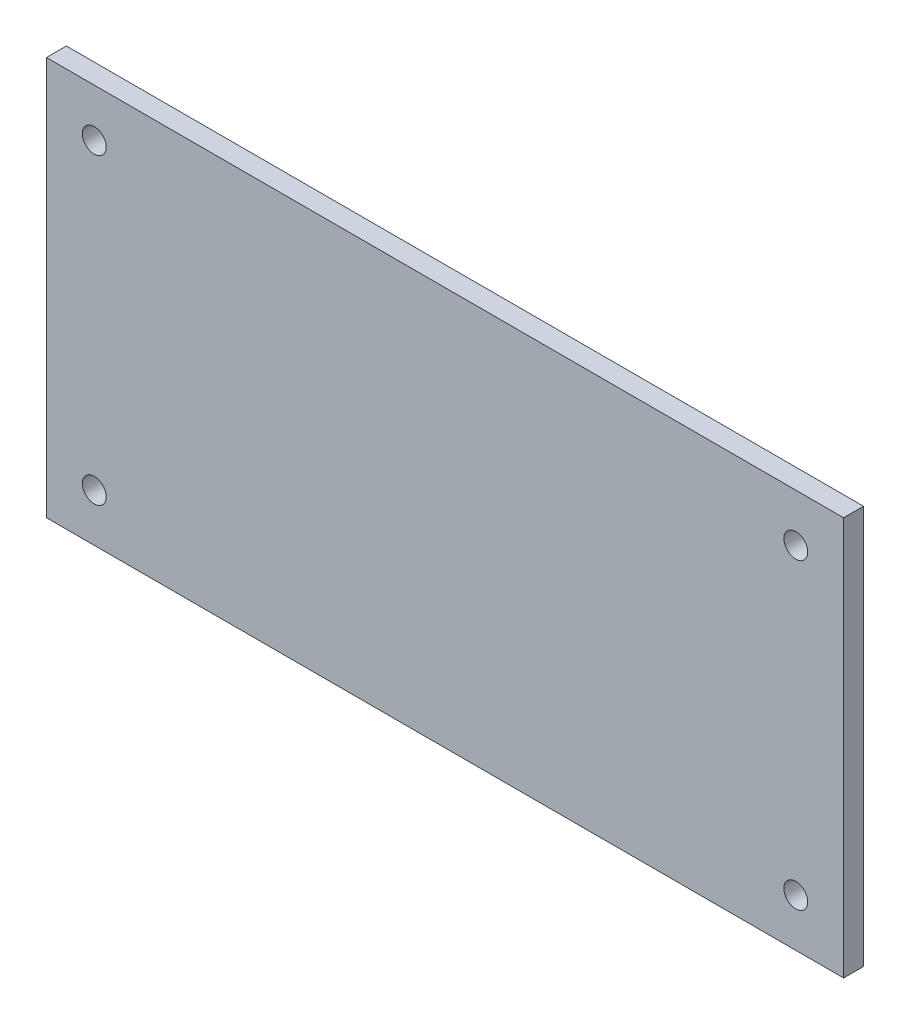
ISO-10303-21;
HEADER;
FILE_DESCRIPTION(('STEP AP214'),'2;1');
FILE_NAME('part.step','',(''),(''),'','','');
FILE_SCHEMA(('AUTOMOTIVE_DESIGN { 1 0 10303 214 1 1 1 1 }'));
ENDSEC;
DATA;
#1=APPLICATION_CONTEXT('core data for automotive mechanical design processes');
#2=APPLICATION_PROTOCOL_DEFINITION('international standard','automotive_design',2000,#1);
#3=PRODUCT_CONTEXT('',#1,'mechanical');
#4=PRODUCT('Part','Part','',(#3));
#5=PRODUCT_RELATED_PRODUCT_CATEGORY('part','',(#4));
#6=PRODUCT_DEFINITION_FORMATION('','',#4);
#7=PRODUCT_DEFINITION_CONTEXT('part definition',#1,'design');
#8=PRODUCT_DEFINITION('design','',#6,#7);
#9=PRODUCT_DEFINITION_SHAPE('','',#8);
#10=(LENGTH_UNIT() NAMED_UNIT(*) SI_UNIT(.MILLI.,.METRE.));
#11=(NAMED_UNIT(*) PLANE_ANGLE_UNIT() SI_UNIT($,.RADIAN.));
#12=(NAMED_UNIT(*) SI_UNIT($,.STERADIAN.) SOLID_ANGLE_UNIT());
#13=UNCERTAINTY_MEASURE_WITH_UNIT(LENGTH_MEASURE(1.E-05),#10,'distance_accuracy_value','');
#14=(GEOMETRIC_REPRESENTATION_CONTEXT(3) GLOBAL_UNCERTAINTY_ASSIGNED_CONTEXT((#13)) GLOBAL_UNIT_ASSIGNED_CONTEXT((#10,
#11,#12)) REPRESENTATION_CONTEXT('',''));
#15=CARTESIAN_POINT('',(0.,0.,0.));
#16=DIRECTION('',(0.,0.,1.));
#17=DIRECTION('',(1.,0.,0.));
#18=AXIS2_PLACEMENT_3D('',#15,#16,#17);
#19=CARTESIAN_POINT('',(1000.,-500.,50.));
#20=DIRECTION('',(-1.,0.,0.));
#21=DIRECTION('',(0.,0.,1.));
#22=AXIS2_PLACEMENT_3D('',#19,#20,#21);
#23=PLANE('',#22);
#24=DIRECTION('',(0.,1.,0.));
#25=VECTOR('',#24,1.);
#26=CARTESIAN_POINT('',(1000.,-500.,0.));
#27=LINE('',#26,#25);
#28=CARTESIAN_POINT('',(1000.,-500.,0.));
#29=VERTEX_POINT('',#28);
#30=CARTESIAN_POINT('',(1000.,500.,0.));
#31=VERTEX_POINT('',#30);
#32=EDGE_CURVE('E104',#29,#31,#27,.T.);
#33=ORIENTED_EDGE('',*,*,#32,.T.);
#34=DIRECTION('',(0.,0.,-1.));
#35=VECTOR('',#34,1.);
#36=CARTESIAN_POINT('',(1000.,500.,50.));
#37=LINE('',#36,#35);
#38=CARTESIAN_POINT('',(1000.,500.,50.));
#39=VERTEX_POINT('',#38);
#40=EDGE_CURVE('E11',#39,#31,#37,.T.);
#41=ORIENTED_EDGE('',*,*,#40,.F.);
#42=DIRECTION('',(0.,1.,0.));
#43=VECTOR('',#42,1.);
#44=CARTESIAN_POINT('',(1000.,-500.,50.));
#45=LINE('',#44,#43);
#46=CARTESIAN_POINT('',(1000.,-500.,50.));
#47=VERTEX_POINT('',#46);
#48=EDGE_CURVE('E92',#47,#39,#45,.T.);
#49=ORIENTED_EDGE('',*,*,#48,.F.);
#50=DIRECTION('',(0.,0.,-1.));
#51=VECTOR('',#50,1.);
#52=CARTESIAN_POINT('',(1000.,-500.,50.));
#53=LINE('',#52,#51);
#54=EDGE_CURVE('E100',#47,#29,#53,.T.);
#55=ORIENTED_EDGE('',*,*,#54,.T.);
#56=EDGE_LOOP('',(#33,#41,#49,#55));
#57=FACE_BOUND('',#56,.T.);
#58=ADVANCED_FACE('F41',(#57),#23,.F.);
#59=CARTESIAN_POINT('',(-1000.,500.,50.));
#60=DIRECTION('',(0.,-1.,0.));
#61=DIRECTION('',(0.,0.,-1.));
#62=AXIS2_PLACEMENT_3D('',#59,#60,#61);
#63=PLANE('',#62);
#64=DIRECTION('',(-1.,0.,0.));
#65=VECTOR('',#64,1.);
#66=CARTESIAN_POINT('',(-1000.,500.,0.));
#67=LINE('',#66,#65);
#68=CARTESIAN_POINT('',(-1000.,500.,0.));
#69=VERTEX_POINT('',#68);
#70=EDGE_CURVE('E96',#31,#69,#67,.T.);
#71=ORIENTED_EDGE('',*,*,#70,.T.);
#72=DIRECTION('',(0.,0.,-1.));
#73=VECTOR('',#72,1.);
#74=CARTESIAN_POINT('',(-1000.,500.,50.));
#75=LINE('',#74,#73);
#76=CARTESIAN_POINT('',(-1000.,500.,50.));
#77=VERTEX_POINT('',#76);
#78=EDGE_CURVE('E49',#77,#69,#75,.T.);
#79=ORIENTED_EDGE('',*,*,#78,.F.);
#80=DIRECTION('',(-1.,0.,0.));
#81=VECTOR('',#80,1.);
#82=CARTESIAN_POINT('',(-1000.,500.,50.));
#83=LINE('',#82,#81);
#84=EDGE_CURVE('E87',#39,#77,#83,.T.);
#85=ORIENTED_EDGE('',*,*,#84,.F.);
#86=ORIENTED_EDGE('',*,*,#40,.T.);
#87=EDGE_LOOP('',(#71,#79,#85,#86));
#88=FACE_BOUND('',#87,.T.);
#89=ADVANCED_FACE('F95',(#88),#63,.F.);
#90=CARTESIAN_POINT('',(-1000.,-500.,50.));
#91=DIRECTION('',(1.,0.,0.));
#92=DIRECTION('',(0.,0.,-1.));
#93=AXIS2_PLACEMENT_3D('',#90,#91,#92);
#94=PLANE('',#93);
#95=DIRECTION('',(0.,-1.,0.));
#96=VECTOR('',#95,1.);
#97=CARTESIAN_POINT('',(-1000.,-500.,0.));
#98=LINE('',#97,#96);
#99=CARTESIAN_POINT('',(-1000.,-500.,0.));
#100=VERTEX_POINT('',#99);
#101=EDGE_CURVE('E74',#69,#100,#98,.T.);
#102=ORIENTED_EDGE('',*,*,#101,.T.);
#103=DIRECTION('',(0.,0.,-1.));
#104=VECTOR('',#103,1.);
#105=CARTESIAN_POINT('',(-1000.,-500.,50.));
#106=LINE('',#105,#104);
#107=CARTESIAN_POINT('',(-1000.,-500.,50.));
#108=VERTEX_POINT('',#107);
#109=EDGE_CURVE('E97',#108,#100,#106,.T.);
#110=ORIENTED_EDGE('',*,*,#109,.F.);
#111=DIRECTION('',(0.,-1.,0.));
#112=VECTOR('',#111,1.);
#113=CARTESIAN_POINT('',(-1000.,-500.,50.));
#114=LINE('',#113,#112);
#115=EDGE_CURVE('E90',#77,#108,#114,.T.);
#116=ORIENTED_EDGE('',*,*,#115,.F.);
#117=ORIENTED_EDGE('',*,*,#78,.T.);
#118=EDGE_LOOP('',(#102,#110,#116,#117));
#119=FACE_BOUND('',#118,.T.);
#120=ADVANCED_FACE('F98',(#119),#94,.F.);
#121=CARTESIAN_POINT('',(-1000.,-500.,50.));
#122=DIRECTION('',(0.,1.,0.));
#123=DIRECTION('',(0.,0.,1.));
#124=AXIS2_PLACEMENT_3D('',#121,#122,#123);
#125=PLANE('',#124);
#126=DIRECTION('',(1.,0.,0.));
#127=VECTOR('',#126,1.);
#128=CARTESIAN_POINT('',(-1000.,-500.,0.));
#129=LINE('',#128,#127);
#130=EDGE_CURVE('E80',#100,#29,#129,.T.);
#131=ORIENTED_EDGE('',*,*,#130,.T.);
#132=ORIENTED_EDGE('',*,*,#54,.F.);
#133=DIRECTION('',(1.,0.,0.));
#134=VECTOR('',#133,1.);
#135=CARTESIAN_POINT('',(-1000.,-500.,50.));
#136=LINE('',#135,#134);
#137=EDGE_CURVE('E57',#108,#47,#136,.T.);
#138=ORIENTED_EDGE('',*,*,#137,.F.);
#139=ORIENTED_EDGE('',*,*,#109,.T.);
#140=EDGE_LOOP('',(#131,#132,#138,#139));
#141=FACE_BOUND('',#140,.T.);
#142=ADVANCED_FACE('F112',(#141),#125,.F.);
#143=CARTESIAN_POINT('',(0.,0.,50.));
#144=DIRECTION('',(0.,0.,-1.));
#145=DIRECTION('',(-1.,0.,0.));
#146=AXIS2_PLACEMENT_3D('',#143,#144,#145);
#147=PLANE('',#146);
#148=CARTESIAN_POINT('',(-880.,-380.,50.));
#149=DIRECTION('',(0.,0.,1.));
#150=DIRECTION('',(1.,0.,0.));
#151=AXIS2_PLACEMENT_3D('',#148,#149,#150);
#152=CIRCLE('',#151,30.0000000000001);
#153=CARTESIAN_POINT('',(-850.,-380.,50.));
#154=VERTEX_POINT('',#153);
#155=EDGE_CURVE('E133',#154,#154,#152,.T.);
#156=ORIENTED_EDGE('',*,*,#155,.F.);
#157=EDGE_LOOP('',(#156));
#158=FACE_BOUND('',#157,.T.);
#159=CARTESIAN_POINT('',(-880.,380.,50.));
#160=DIRECTION('',(0.,0.,1.));
#161=DIRECTION('',(1.,0.,0.));
#162=AXIS2_PLACEMENT_3D('',#159,#160,#161);
#163=CIRCLE('',#162,30.0000000000001);
#164=CARTESIAN_POINT('',(-850.,380.,50.));
#165=VERTEX_POINT('',#164);
#166=EDGE_CURVE('E127',#165,#165,#163,.T.);
#167=ORIENTED_EDGE('',*,*,#166,.F.);
#168=EDGE_LOOP('',(#167));
#169=FACE_BOUND('',#168,.T.);
#170=CARTESIAN_POINT('',(880.,-380.,50.));
#171=DIRECTION('',(0.,0.,1.));
#172=DIRECTION('',(1.,0.,0.));
#173=AXIS2_PLACEMENT_3D('',#170,#171,#172);
#174=CIRCLE('',#173,30.0000000000001);
#175=CARTESIAN_POINT('',(910.,-380.,50.));
#176=VERTEX_POINT('',#175);
#177=EDGE_CURVE('E121',#176,#176,#174,.T.);
#178=ORIENTED_EDGE('',*,*,#177,.F.);
#179=EDGE_LOOP('',(#178));
#180=FACE_BOUND('',#179,.T.);
#181=CARTESIAN_POINT('',(880.,380.,50.));
#182=DIRECTION('',(0.,0.,1.));
#183=DIRECTION('',(1.,0.,0.));
#184=AXIS2_PLACEMENT_3D('',#181,#182,#183);
#185=CIRCLE('',#184,30.0000000000001);
#186=CARTESIAN_POINT('',(910.,380.,50.));
#187=VERTEX_POINT('',#186);
#188=EDGE_CURVE('E107',#187,#187,#185,.T.);
#189=ORIENTED_EDGE('',*,*,#188,.F.);
#190=EDGE_LOOP('',(#189));
#191=FACE_BOUND('',#190,.T.);
#192=ORIENTED_EDGE('',*,*,#48,.T.);
#193=ORIENTED_EDGE('',*,*,#84,.T.);
#194=ORIENTED_EDGE('',*,*,#115,.T.);
#195=ORIENTED_EDGE('',*,*,#137,.T.);
#196=EDGE_LOOP('',(#192,#193,#194,#195));
#197=FACE_BOUND('',#196,.T.);
#198=ADVANCED_FACE('F88',(#158,#169,#180,#191,#197),#147,.F.);
#199=CARTESIAN_POINT('',(0.,0.,0.));
#200=DIRECTION('',(0.,0.,-1.));
#201=DIRECTION('',(-1.,0.,0.));
#202=AXIS2_PLACEMENT_3D('',#199,#200,#201);
#203=PLANE('',#202);
#204=CARTESIAN_POINT('',(-880.,-380.,0.));
#205=DIRECTION('',(0.,0.,1.));
#206=DIRECTION('',(1.,0.,0.));
#207=AXIS2_PLACEMENT_3D('',#204,#205,#206);
#208=CIRCLE('',#207,30.0000000000001);
#209=CARTESIAN_POINT('',(-850.,-380.,0.));
#210=VERTEX_POINT('',#209);
#211=EDGE_CURVE('E136',#210,#210,#208,.T.);
#212=ORIENTED_EDGE('',*,*,#211,.T.);
#213=EDGE_LOOP('',(#212));
#214=FACE_BOUND('',#213,.T.);
#215=CARTESIAN_POINT('',(-880.,380.,0.));
#216=DIRECTION('',(0.,0.,1.));
#217=DIRECTION('',(1.,0.,0.));
#218=AXIS2_PLACEMENT_3D('',#215,#216,#217);
#219=CIRCLE('',#218,30.0000000000001);
#220=CARTESIAN_POINT('',(-850.,380.,0.));
#221=VERTEX_POINT('',#220);
#222=EDGE_CURVE('E130',#221,#221,#219,.T.);
#223=ORIENTED_EDGE('',*,*,#222,.T.);
#224=EDGE_LOOP('',(#223));
#225=FACE_BOUND('',#224,.T.);
#226=CARTESIAN_POINT('',(880.,-380.,0.));
#227=DIRECTION('',(0.,0.,1.));
#228=DIRECTION('',(1.,0.,0.));
#229=AXIS2_PLACEMENT_3D('',#226,#227,#228);
#230=CIRCLE('',#229,30.0000000000001);
#231=CARTESIAN_POINT('',(910.,-380.,0.));
#232=VERTEX_POINT('',#231);
#233=EDGE_CURVE('E124',#232,#232,#230,.T.);
#234=ORIENTED_EDGE('',*,*,#233,.T.);
#235=EDGE_LOOP('',(#234));
#236=FACE_BOUND('',#235,.T.);
#237=CARTESIAN_POINT('',(880.,380.,0.));
#238=DIRECTION('',(0.,0.,1.));
#239=DIRECTION('',(1.,0.,0.));
#240=AXIS2_PLACEMENT_3D('',#237,#238,#239);
#241=CIRCLE('',#240,30.0000000000001);
#242=CARTESIAN_POINT('',(910.,380.,0.));
#243=VERTEX_POINT('',#242);
#244=EDGE_CURVE('E118',#243,#243,#241,.T.);
#245=ORIENTED_EDGE('',*,*,#244,.T.);
#246=EDGE_LOOP('',(#245));
#247=FACE_BOUND('',#246,.T.);
#248=ORIENTED_EDGE('',*,*,#32,.F.);
#249=ORIENTED_EDGE('',*,*,#130,.F.);
#250=ORIENTED_EDGE('',*,*,#101,.F.);
#251=ORIENTED_EDGE('',*,*,#70,.F.);
#252=EDGE_LOOP('',(#248,#249,#250,#251));
#253=FACE_BOUND('',#252,.T.);
#254=ADVANCED_FACE('F115',(#214,#225,#236,#247,#253),#203,.T.);
#255=CARTESIAN_POINT('',(880.,380.,50.));
#256=DIRECTION('',(0.,0.,-1.));
#257=DIRECTION('',(-1.,0.,0.));
#258=AXIS2_PLACEMENT_3D('',#255,#256,#257);
#259=CYLINDRICAL_SURFACE('',#258,30.0000000000001);
#260=ORIENTED_EDGE('',*,*,#188,.T.);
#261=EDGE_LOOP('',(#260));
#262=FACE_BOUND('',#261,.T.);
#263=ORIENTED_EDGE('',*,*,#244,.F.);
#264=EDGE_LOOP('',(#263));
#265=FACE_BOUND('',#264,.T.);
#266=ADVANCED_FACE('F154',(#262,#265),#259,.F.);
#267=CARTESIAN_POINT('',(880.,-380.,50.));
#268=DIRECTION('',(0.,0.,-1.));
#269=DIRECTION('',(-1.,0.,0.));
#270=AXIS2_PLACEMENT_3D('',#267,#268,#269);
#271=CYLINDRICAL_SURFACE('',#270,30.0000000000001);
#272=ORIENTED_EDGE('',*,*,#177,.T.);
#273=EDGE_LOOP('',(#272));
#274=FACE_BOUND('',#273,.T.);
#275=ORIENTED_EDGE('',*,*,#233,.F.);
#276=EDGE_LOOP('',(#275));
#277=FACE_BOUND('',#276,.T.);
#278=ADVANCED_FACE('F157',(#274,#277),#271,.F.);
#279=CARTESIAN_POINT('',(-880.,380.,50.));
#280=DIRECTION('',(0.,0.,-1.));
#281=DIRECTION('',(-1.,0.,0.));
#282=AXIS2_PLACEMENT_3D('',#279,#280,#281);
#283=CYLINDRICAL_SURFACE('',#282,30.0000000000001);
#284=ORIENTED_EDGE('',*,*,#166,.T.);
#285=EDGE_LOOP('',(#284));
#286=FACE_BOUND('',#285,.T.);
#287=ORIENTED_EDGE('',*,*,#222,.F.);
#288=EDGE_LOOP('',(#287));
#289=FACE_BOUND('',#288,.T.);
#290=ADVANCED_FACE('F195',(#286,#289),#283,.F.);
#291=CARTESIAN_POINT('',(-880.,-380.,50.));
#292=DIRECTION('',(0.,0.,-1.));
#293=DIRECTION('',(-1.,0.,0.));
#294=AXIS2_PLACEMENT_3D('',#291,#292,#293);
#295=CYLINDRICAL_SURFACE('',#294,30.0000000000001);
#296=ORIENTED_EDGE('',*,*,#155,.T.);
#297=EDGE_LOOP('',(#296));
#298=FACE_BOUND('',#297,.T.);
#299=ORIENTED_EDGE('',*,*,#211,.F.);
#300=EDGE_LOOP('',(#299));
#301=FACE_BOUND('',#300,.T.);
#302=ADVANCED_FACE('F142',(#298,#301),#295,.F.);
#303=CLOSED_SHELL('',(#58,#89,#120,#142,#198,#254,#266,#278,#290,#302));
#304=MANIFOLD_SOLID_BREP('B2',#303);
#305=ADVANCED_BREP_SHAPE_REPRESENTATION('',(#18,#304),#14);
#306=SHAPE_DEFINITION_REPRESENTATION(#9,#305);
ENDSEC;
END-ISO-10303-21;
